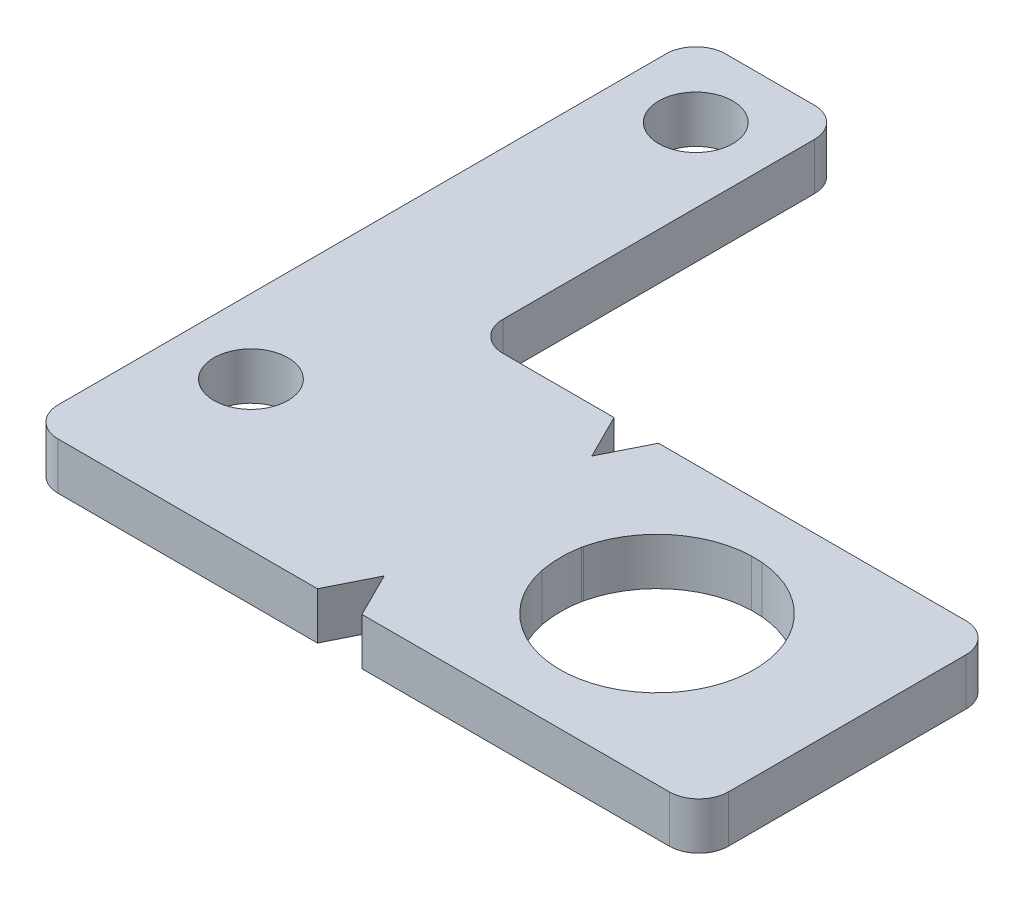
ISO-10303-21;
HEADER;
FILE_DESCRIPTION(('STEP AP214'),'2;1');
FILE_NAME('part.step','',(''),(''),'','','');
FILE_SCHEMA(('AUTOMOTIVE_DESIGN { 1 0 10303 214 1 1 1 1 }'));
ENDSEC;
DATA;
#1=APPLICATION_CONTEXT('core data for automotive mechanical design processes');
#2=APPLICATION_PROTOCOL_DEFINITION('international standard','automotive_design',2000,#1);
#3=PRODUCT_CONTEXT('',#1,'mechanical');
#4=PRODUCT('Part','Part','',(#3));
#5=PRODUCT_RELATED_PRODUCT_CATEGORY('part','',(#4));
#6=PRODUCT_DEFINITION_FORMATION('','',#4);
#7=PRODUCT_DEFINITION_CONTEXT('part definition',#1,'design');
#8=PRODUCT_DEFINITION('design','',#6,#7);
#9=PRODUCT_DEFINITION_SHAPE('','',#8);
#10=(LENGTH_UNIT() NAMED_UNIT(*) SI_UNIT(.MILLI.,.METRE.));
#11=(NAMED_UNIT(*) PLANE_ANGLE_UNIT() SI_UNIT($,.RADIAN.));
#12=(NAMED_UNIT(*) SI_UNIT($,.STERADIAN.) SOLID_ANGLE_UNIT());
#13=UNCERTAINTY_MEASURE_WITH_UNIT(LENGTH_MEASURE(1.E-05),#10,'distance_accuracy_value','');
#14=(GEOMETRIC_REPRESENTATION_CONTEXT(3) GLOBAL_UNCERTAINTY_ASSIGNED_CONTEXT((#13)) GLOBAL_UNIT_ASSIGNED_CONTEXT((#10,
#11,#12)) REPRESENTATION_CONTEXT('',''));
#15=CARTESIAN_POINT('',(0.,0.,0.));
#16=DIRECTION('',(0.,0.,1.));
#17=DIRECTION('',(1.,0.,0.));
#18=AXIS2_PLACEMENT_3D('',#15,#16,#17);
#19=CARTESIAN_POINT('',(45.2120566751476,-1.49186218934005E-13,-20.));
#20=DIRECTION('',(0.,0.,1.));
#21=DIRECTION('',(-1.,0.,0.));
#22=AXIS2_PLACEMENT_3D('',#19,#20,#21);
#23=PLANE('',#22);
#24=DIRECTION('',(-1.,0.,0.));
#25=VECTOR('',#24,1.);
#26=CARTESIAN_POINT('',(45.2120566751476,3.17499999999985,-20.));
#27=LINE('',#26,#25);
#28=CARTESIAN_POINT('',(12.,3.175,-20.));
#29=VERTEX_POINT('',#28);
#30=CARTESIAN_POINT('',(19.4872783375738,3.175,-20.));
#31=VERTEX_POINT('',#30);
#32=EDGE_CURVE('E284',#29,#31,#27,.F.);
#33=ORIENTED_EDGE('',*,*,#32,.T.);
#34=DIRECTION('',(0.,1.,0.));
#35=VECTOR('',#34,1.);
#36=CARTESIAN_POINT('',(19.4872783375738,3.175,-20.));
#37=LINE('',#36,#35);
#38=CARTESIAN_POINT('',(19.4872783375738,0.,-20.));
#39=VERTEX_POINT('',#38);
#40=EDGE_CURVE('E269',#39,#31,#37,.T.);
#41=ORIENTED_EDGE('',*,*,#40,.F.);
#42=DIRECTION('',(1.,0.,0.));
#43=VECTOR('',#42,1.);
#44=CARTESIAN_POINT('',(18.0370566751476,0.,-20.));
#45=LINE('',#44,#43);
#46=CARTESIAN_POINT('',(12.,0.,-20.));
#47=VERTEX_POINT('',#46);
#48=EDGE_CURVE('E401',#47,#39,#45,.T.);
#49=ORIENTED_EDGE('',*,*,#48,.F.);
#50=DIRECTION('',(0.,1.,0.));
#51=VECTOR('',#50,1.);
#52=CARTESIAN_POINT('',(12.,3.175,-20.));
#53=LINE('',#52,#51);
#54=EDGE_CURVE('E291',#47,#29,#53,.T.);
#55=ORIENTED_EDGE('',*,*,#54,.T.);
#56=EDGE_LOOP('',(#33,#41,#49,#55));
#57=FACE_BOUND('',#56,.T.);
#58=ADVANCED_FACE('F106',(#57),#23,.F.);
#59=CARTESIAN_POINT('',(21.2120566751476,0.,0.));
#60=DIRECTION('',(0.,0.,-1.));
#61=DIRECTION('',(0.,1.,0.));
#62=AXIS2_PLACEMENT_3D('',#59,#60,#61);
#63=PLANE('',#62);
#64=DIRECTION('',(1.,0.,0.));
#65=VECTOR('',#64,1.);
#66=CARTESIAN_POINT('',(21.2120566751477,3.17500000000001,0.));
#67=LINE('',#66,#65);
#68=CARTESIAN_POINT('',(43.2120566751477,3.17499999999986,0.));
#69=VERTEX_POINT('',#68);
#70=CARTESIAN_POINT('',(22.4872783375738,3.175,0.));
#71=VERTEX_POINT('',#70);
#72=EDGE_CURVE('E404',#69,#71,#67,.F.);
#73=ORIENTED_EDGE('',*,*,#72,.T.);
#74=DIRECTION('',(0.,1.,0.));
#75=VECTOR('',#74,1.);
#76=CARTESIAN_POINT('',(22.4872783375738,3.175,0.));
#77=LINE('',#76,#75);
#78=CARTESIAN_POINT('',(22.4872783375738,0.,0.));
#79=VERTEX_POINT('',#78);
#80=EDGE_CURVE('E629',#79,#71,#77,.T.);
#81=ORIENTED_EDGE('',*,*,#80,.F.);
#82=DIRECTION('',(-1.,0.,0.));
#83=VECTOR('',#82,1.);
#84=CARTESIAN_POINT('',(18.0370566751476,0.,0.));
#85=LINE('',#84,#83);
#86=CARTESIAN_POINT('',(43.2120566751476,-1.38777878078145E-13,0.));
#87=VERTEX_POINT('',#86);
#88=EDGE_CURVE('E309',#87,#79,#85,.T.);
#89=ORIENTED_EDGE('',*,*,#88,.F.);
#90=DIRECTION('',(0.,1.,0.));
#91=VECTOR('',#90,1.);
#92=CARTESIAN_POINT('',(43.2120566751476,-1.38777878078145E-13,0.));
#93=LINE('',#92,#91);
#94=EDGE_CURVE('E330',#87,#69,#93,.T.);
#95=ORIENTED_EDGE('',*,*,#94,.T.);
#96=EDGE_LOOP('',(#73,#81,#89,#95));
#97=FACE_BOUND('',#96,.T.);
#98=ADVANCED_FACE('F602',(#97),#63,.F.);
#99=CARTESIAN_POINT('',(18.0370566751476,0.,0.));
#100=DIRECTION('',(0.,1.,0.));
#101=DIRECTION('',(-1.,0.,0.));
#102=AXIS2_PLACEMENT_3D('',#99,#100,#101);
#103=PLANE('',#102);
#104=DIRECTION('',(-0.210954578665915,0.,0.97749586481984));
#105=VECTOR('',#104,1.);
#106=CARTESIAN_POINT('',(25.9947010578456,0.,-11.428387084073));
#107=LINE('',#106,#105);
#108=CARTESIAN_POINT('',(25.9947010578456,0.,-11.428387084073));
#109=VERTEX_POINT('',#108);
#110=CARTESIAN_POINT('',(25.9745566751476,0.,-11.3350444749145));
#111=VERTEX_POINT('',#110);
#112=EDGE_CURVE('E714',#109,#111,#107,.T.);
#113=ORIENTED_EDGE('',*,*,#112,.T.);
#114=CARTESIAN_POINT('',(25.9745566751476,0.,-8.66495552508574));
#115=CARTESIAN_POINT('',(25.9336611254421,0.,-8.90403039773948));
#116=CARTESIAN_POINT('',(25.9026822704654,0.,-9.13485281782535));
#117=CARTESIAN_POINT('',(25.8710890300934,0.,-9.46870776910235));
#118=CARTESIAN_POINT('',(25.8630371236516,0.,-9.57792963971937));
#119=CARTESIAN_POINT('',(25.8518916581324,0.,-9.7922471546695));
#120=CARTESIAN_POINT('',(25.8488343775111,0.,-9.89125889598037));
#121=CARTESIAN_POINT('',(25.8455810582544,0.,-10.4368410670471));
#122=CARTESIAN_POINT('',(25.8877053787503,0.,-10.881730781954));
#123=CARTESIAN_POINT('',(25.9745566751476,0.,-11.3350444749145));
#124=B_SPLINE_CURVE_WITH_KNOTS('',3,(#114,#115,#116,#117,#118,#119,#120,#121,#122,#123),
.UNSPECIFIED.,.F.,.F.,(4,2,2,2,4),(0.,0.25,0.375,0.5,1.),.UNSPECIFIED.);
#125=CARTESIAN_POINT('',(25.9745566751476,0.,-8.66495552508574));
#126=VERTEX_POINT('',#125);
#127=EDGE_CURVE('E435',#126,#111,#124,.T.);
#128=ORIENTED_EDGE('',*,*,#127,.F.);
#129=CARTESIAN_POINT('',(25.9745566751477,0.,-8.66495552508554));
#130=CARTESIAN_POINT('',(26.0312900601747,0.,-8.43026918197621));
#131=CARTESIAN_POINT('',(26.1447568302288,0.,-7.96089649575754));
#132=CARTESIAN_POINT('',(26.4121105401859,0.,-7.28608934983438));
#133=CARTESIAN_POINT('',(26.7467661099225,0.,-6.64323408484291));
#134=CARTESIAN_POINT('',(27.1517637105194,0.,-6.04165964216339));
#135=CARTESIAN_POINT('',(27.6202515925038,0.,-5.48831044677415));
#136=CARTESIAN_POINT('',(28.1470236467033,0.,-4.99004629682458));
#137=CARTESIAN_POINT('',(28.7255138680024,0.,-4.552919680838));
#138=CARTESIAN_POINT('',(29.348698845445,0.,-4.18227312022696));
#139=CARTESIAN_POINT('',(30.0089631292878,0.,-3.88262809145767));
#140=CARTESIAN_POINT('',(30.6982512156172,0.,-3.65764213636265));
#141=CARTESIAN_POINT('',(31.40815003869,0.,-3.51006093026402));
#142=CARTESIAN_POINT('',(32.129995886556,0.,-3.44168565515418));
#143=CARTESIAN_POINT('',(32.8549790007588,0.,-3.45335078084182));
#144=CARTESIAN_POINT('',(33.5742513986522,0.,-3.54491394409852));
#145=CARTESIAN_POINT('',(34.2790347763197,0.,-3.71525766914056));
#146=CARTESIAN_POINT('',(34.9607276645069,0.,-3.96230301031872));
#147=CARTESIAN_POINT('',(35.6110103986844,0.,-4.28303492321889));
#148=CARTESIAN_POINT('',(36.2219466572717,0.,-4.67353906184797));
#149=CARTESIAN_POINT('',(36.7860803193948,0.,-5.12904955085714));
#150=CARTESIAN_POINT('',(37.2965264626067,0.,-5.64400715029524));
#151=CARTESIAN_POINT('',(37.7470553893225,0.,-6.21212710288561));
#152=CARTESIAN_POINT('',(38.1321686566539,0.,-6.82647583582406));
#153=CARTESIAN_POINT('',(38.4471661816975,0.,-7.47955558100038));
#154=CARTESIAN_POINT('',(38.6882036033045,0.,-8.16339588085632));
#155=CARTESIAN_POINT('',(38.8523392002772,0.,-8.86965086328776));
#156=CARTESIAN_POINT('',(38.937569793324,0.,-9.58970109772035));
#157=CARTESIAN_POINT('',(38.9428551928322,0.,-10.3147587918309));
#158=CARTESIAN_POINT('',(38.8681308932633,0.,-11.0359750354711));
#159=CARTESIAN_POINT('',(38.71430886232,0.,-11.744547818694));
#160=CARTESIAN_POINT('',(38.4832664037636,0.,-12.4318293721623));
#161=CARTESIAN_POINT('',(38.1778232726974,0.,-13.0894320178612));
#162=CARTESIAN_POINT('',(37.8017071625224,0.,-13.7093293798909));
#163=CARTESIAN_POINT('',(37.3595085822399,0.,-14.2839586556845));
#164=CARTESIAN_POINT('',(36.8566234450337,0.,-14.8062968156151));
#165=CARTESIAN_POINT('',(36.299192390395,0.,-15.2700064009538));
#166=CARTESIAN_POINT('',(35.6940065237312,0.,-15.6692886249439));
#167=CARTESIAN_POINT('',(35.0484966286503,0.,-15.9997910332968));
#168=CARTESIAN_POINT('',(34.3703734209777,0.,-16.2555373085362));
#169=CARTESIAN_POINT('',(33.6685375806048,0.,-16.4406565770764));
#170=CARTESIAN_POINT('',(33.1889949501497,0.,-16.4974394270471));
#171=CARTESIAN_POINT('',(32.9492236349221,0.,-16.5258308520324));
#172=B_SPLINE_CURVE_WITH_KNOTS('',3,(#129,#130,#131,#132,#133,#134,#135,#136,#137,#138,#139,
#140,#141,#142,#143,#144,#145,#146,#147,#148,#149,#150,#151,#152,#153,#154,#155,#156,#157,#158,
#159,#160,#161,#162,#163,#164,#165,#166,#167,#168,#169,#170,#171),.UNSPECIFIED.,.F.,.F.,(4,1,1,
1,1,1,1,1,1,1,1,1,1,1,1,1,1,1,1,1,1,1,1,1,1,1,1,1,1,1,1,1,1,1,1,1,1,1,1,1,4),(0.,0.025,0.05,
0.075,0.1,0.125,0.15,0.175,0.2,0.225,0.25,0.275,0.3,0.325,0.35,0.375,0.4,0.425,0.45,0.475,0.5,
0.525,0.55,0.575,0.6,0.625,0.65,0.675,0.7,0.725,0.75,0.775,0.8,0.825,0.85,0.875,0.9,0.925,0.95,
0.975,1.),.UNSPECIFIED.);
#173=CARTESIAN_POINT('',(32.9492236349221,0.,-16.5258308520324));
#174=VERTEX_POINT('',#173);
#175=EDGE_CURVE('E380',#126,#174,#172,.T.);
#176=ORIENTED_EDGE('',*,*,#175,.T.);
#177=DIRECTION('',(-0.999529779588222,0.,-0.0306630024022591));
#178=VECTOR('',#177,1.);
#179=CARTESIAN_POINT('',(32.9492236349221,0.,-16.5258308520324));
#180=LINE('',#179,#178);
#181=CARTESIAN_POINT('',(32.2259617867948,0.,-16.5480186649816));
#182=VERTEX_POINT('',#181);
#183=EDGE_CURVE('E302',#174,#182,#180,.T.);
#184=ORIENTED_EDGE('',*,*,#183,.T.);
#185=CARTESIAN_POINT('',(32.2259617867948,0.,-16.5480186649816));
#186=CARTESIAN_POINT('',(31.9849010309936,0.,-16.5343779314185));
#187=CARTESIAN_POINT('',(31.5027795193912,0.,-16.5070964642925));
#188=CARTESIAN_POINT('',(30.7909161828021,0.,-16.3653458438791));
#189=CARTESIAN_POINT('',(30.0983915048754,0.,-16.1516475424966));
#190=CARTESIAN_POINT('',(29.4338370293086,0.,-15.8613344543529));
#191=CARTESIAN_POINT('',(28.8053126701854,0.,-15.499899602249));
#192=CARTESIAN_POINT('',(28.2205118605238,0.,-15.0712295735479));
#193=CARTESIAN_POINT('',(27.6865317005137,0.,-14.5807041723674));
#194=CARTESIAN_POINT('',(27.2100266580371,0.,-14.0342419441934));
#195=CARTESIAN_POINT('',(26.796302046705,0.,-13.4386361298149));
#196=CARTESIAN_POINT('',(26.4523101933546,0.,-12.8007278304648));
#197=CARTESIAN_POINT('',(26.17514723399,0.,-12.1298900390997));
#198=CARTESIAN_POINT('',(26.0548497832271,0.,-11.6622214024152));
#199=CARTESIAN_POINT('',(25.9947010578456,0.,-11.428387084073));
#200=B_SPLINE_CURVE_WITH_KNOTS('',3,(#185,#186,#187,#188,#189,#190,#191,#192,#193,#194,#195,
#196,#197,#198,#199),.UNSPECIFIED.,.F.,.F.,(4,1,1,1,1,1,1,1,1,1,1,1,4),(0.,0.083333333333333,
0.166666666666666,0.25,0.333333333333333,0.416666666666667,0.5,0.583333333333333,
0.666666666666666,0.75,0.833333333333333,0.916666666666667,1.),.UNSPECIFIED.);
#201=EDGE_CURVE('E368',#182,#109,#200,.T.);
#202=ORIENTED_EDGE('',*,*,#201,.T.);
#203=EDGE_LOOP('',(#113,#128,#176,#184,#202));
#204=FACE_BOUND('',#203,.T.);
#205=ORIENTED_EDGE('',*,*,#48,.T.);
#206=DIRECTION('',(0.447213595499957,0.,0.894427190999916));
#207=VECTOR('',#206,1.);
#208=CARTESIAN_POINT('',(19.4872783375738,0.,-20.));
#209=LINE('',#208,#207);
#210=CARTESIAN_POINT('',(20.9872783375738,0.,-17.));
#211=VERTEX_POINT('',#210);
#212=EDGE_CURVE('E274',#39,#211,#209,.T.);
#213=ORIENTED_EDGE('',*,*,#212,.T.);
#214=DIRECTION('',(0.447213595499957,0.,-0.894427190999916));
#215=VECTOR('',#214,1.);
#216=CARTESIAN_POINT('',(20.9872783375738,0.,-17.));
#217=LINE('',#216,#215);
#218=CARTESIAN_POINT('',(22.4872783375738,0.,-20.));
#219=VERTEX_POINT('',#218);
#220=EDGE_CURVE('E627',#211,#219,#217,.T.);
#221=ORIENTED_EDGE('',*,*,#220,.T.);
#222=CARTESIAN_POINT('',(43.2120566751476,-1.35308431126191E-13,-20.));
#223=VERTEX_POINT('',#222);
#224=EDGE_CURVE('E403',#219,#223,#45,.T.);
#225=ORIENTED_EDGE('',*,*,#224,.T.);
#226=CARTESIAN_POINT('',(43.2120566751476,-1.35308431126191E-13,-18.));
#227=DIRECTION('',(0.,1.,0.));
#228=DIRECTION('',(-1.,0.,0.));
#229=AXIS2_PLACEMENT_3D('',#226,#227,#228);
#230=CIRCLE('',#229,2.);
#231=CARTESIAN_POINT('',(45.2120566751476,-1.49186218934005E-13,-18.));
#232=VERTEX_POINT('',#231);
#233=EDGE_CURVE('E327',#223,#232,#230,.F.);
#234=ORIENTED_EDGE('',*,*,#233,.T.);
#235=DIRECTION('',(0.,0.,1.));
#236=VECTOR('',#235,1.);
#237=CARTESIAN_POINT('',(45.2120566751476,-1.52655665885959E-13,0.));
#238=LINE('',#237,#236);
#239=CARTESIAN_POINT('',(45.2120566751476,-1.52655665885959E-13,-2.00000000000001));
#240=VERTEX_POINT('',#239);
#241=EDGE_CURVE('E397',#232,#240,#238,.T.);
#242=ORIENTED_EDGE('',*,*,#241,.T.);
#243=CARTESIAN_POINT('',(43.2120566751476,-1.38777878078145E-13,-2.00000000000001));
#244=DIRECTION('',(0.,1.,0.));
#245=DIRECTION('',(-1.,0.,0.));
#246=AXIS2_PLACEMENT_3D('',#243,#244,#245);
#247=CIRCLE('',#246,2.);
#248=EDGE_CURVE('E324',#240,#87,#247,.F.);
#249=ORIENTED_EDGE('',*,*,#248,.T.);
#250=ORIENTED_EDGE('',*,*,#88,.T.);
#251=DIRECTION('',(-0.447213595499961,0.,-0.894427190999915));
#252=VECTOR('',#251,1.);
#253=CARTESIAN_POINT('',(22.4872783375738,0.,0.));
#254=LINE('',#253,#252);
#255=CARTESIAN_POINT('',(20.9872783375738,0.,-3.));
#256=VERTEX_POINT('',#255);
#257=EDGE_CURVE('E647',#79,#256,#254,.T.);
#258=ORIENTED_EDGE('',*,*,#257,.T.);
#259=DIRECTION('',(-0.447213595499961,0.,0.894427190999915));
#260=VECTOR('',#259,1.);
#261=CARTESIAN_POINT('',(20.9872783375738,0.,-3.));
#262=LINE('',#261,#260);
#263=CARTESIAN_POINT('',(19.4872783375738,0.,0.));
#264=VERTEX_POINT('',#263);
#265=EDGE_CURVE('E648',#256,#264,#262,.T.);
#266=ORIENTED_EDGE('',*,*,#265,.T.);
#267=CARTESIAN_POINT('',(2.,0.,0.));
#268=VERTEX_POINT('',#267);
#269=EDGE_CURVE('E396',#264,#268,#85,.T.);
#270=ORIENTED_EDGE('',*,*,#269,.T.);
#271=CARTESIAN_POINT('',(2.,0.,-2.));
#272=DIRECTION('',(0.,-1.,0.));
#273=DIRECTION('',(0.,0.,-1.));
#274=AXIS2_PLACEMENT_3D('',#271,#272,#273);
#275=CIRCLE('',#274,2.);
#276=CARTESIAN_POINT('',(0.,0.,-2.));
#277=VERTEX_POINT('',#276);
#278=EDGE_CURVE('E433',#268,#277,#275,.T.);
#279=ORIENTED_EDGE('',*,*,#278,.T.);
#280=DIRECTION('',(0.,0.,-1.));
#281=VECTOR('',#280,1.);
#282=CARTESIAN_POINT('',(0.,0.,0.));
#283=LINE('',#282,#281);
#284=CARTESIAN_POINT('',(0.,0.,-43.));
#285=VERTEX_POINT('',#284);
#286=EDGE_CURVE('E504',#285,#277,#283,.F.);
#287=ORIENTED_EDGE('',*,*,#286,.F.);
#288=CARTESIAN_POINT('',(2.,0.,-43.));
#289=DIRECTION('',(0.,-1.,0.));
#290=DIRECTION('',(0.,0.,-1.));
#291=AXIS2_PLACEMENT_3D('',#288,#289,#290);
#292=CIRCLE('',#291,2.);
#293=CARTESIAN_POINT('',(2.,0.,-45.));
#294=VERTEX_POINT('',#293);
#295=EDGE_CURVE('E451',#285,#294,#292,.T.);
#296=ORIENTED_EDGE('',*,*,#295,.T.);
#297=DIRECTION('',(1.,0.,0.));
#298=VECTOR('',#297,1.);
#299=CARTESIAN_POINT('',(0.,0.,-45.));
#300=LINE('',#299,#298);
#301=CARTESIAN_POINT('',(8.,0.,-45.));
#302=VERTEX_POINT('',#301);
#303=EDGE_CURVE('E497',#302,#294,#300,.F.);
#304=ORIENTED_EDGE('',*,*,#303,.F.);
#305=CARTESIAN_POINT('',(8.,0.,-43.));
#306=DIRECTION('',(0.,-1.,0.));
#307=DIRECTION('',(0.,0.,-1.));
#308=AXIS2_PLACEMENT_3D('',#305,#306,#307);
#309=CIRCLE('',#308,2.);
#310=CARTESIAN_POINT('',(10.,0.,-43.));
#311=VERTEX_POINT('',#310);
#312=EDGE_CURVE('E448',#302,#311,#309,.T.);
#313=ORIENTED_EDGE('',*,*,#312,.T.);
#314=DIRECTION('',(0.,0.,-1.));
#315=VECTOR('',#314,1.);
#316=CARTESIAN_POINT('',(10.,0.,0.));
#317=LINE('',#316,#315);
#318=CARTESIAN_POINT('',(10.,0.,-22.));
#319=VERTEX_POINT('',#318);
#320=EDGE_CURVE('E279',#319,#311,#317,.T.);
#321=ORIENTED_EDGE('',*,*,#320,.F.);
#322=CARTESIAN_POINT('',(12.,0.,-22.));
#323=DIRECTION('',(0.,-1.,0.));
#324=DIRECTION('',(0.,0.,-1.));
#325=AXIS2_PLACEMENT_3D('',#322,#323,#324);
#326=CIRCLE('',#325,2.);
#327=EDGE_CURVE('E440',#319,#47,#326,.F.);
#328=ORIENTED_EDGE('',*,*,#327,.T.);
#329=EDGE_LOOP('',(#205,#213,#221,#225,#234,#242,#249,#250,#258,#266,#270,#279,#287,#296,#304,
#313,#321,#328));
#330=FACE_BOUND('',#329,.T.);
#331=CARTESIAN_POINT('',(5.,0.,-10.));
#332=DIRECTION('',(0.,1.,0.));
#333=DIRECTION('',(0.,0.,1.));
#334=AXIS2_PLACEMENT_3D('',#331,#332,#333);
#335=CIRCLE('',#334,2.5);
#336=CARTESIAN_POINT('',(5.,0.,-7.5));
#337=VERTEX_POINT('',#336);
#338=EDGE_CURVE('E458',#337,#337,#335,.T.);
#339=ORIENTED_EDGE('',*,*,#338,.T.);
#340=EDGE_LOOP('',(#339));
#341=FACE_BOUND('',#340,.T.);
#342=CARTESIAN_POINT('',(5.,0.,-40.));
#343=DIRECTION('',(0.,1.,0.));
#344=DIRECTION('',(0.,0.,1.));
#345=AXIS2_PLACEMENT_3D('',#342,#343,#344);
#346=CIRCLE('',#345,2.5);
#347=CARTESIAN_POINT('',(5.,0.,-37.5));
#348=VERTEX_POINT('',#347);
#349=EDGE_CURVE('E454',#348,#348,#346,.T.);
#350=ORIENTED_EDGE('',*,*,#349,.T.);
#351=EDGE_LOOP('',(#350));
#352=FACE_BOUND('',#351,.T.);
#353=ADVANCED_FACE('F608',(#204,#330,#341,#352),#103,.F.);
#354=CARTESIAN_POINT('',(0.,3.175,0.));
#355=DIRECTION('',(0.,-1.,0.));
#356=DIRECTION('',(0.,0.,-1.));
#357=AXIS2_PLACEMENT_3D('',#354,#355,#356);
#358=PLANE('',#357);
#359=DIRECTION('',(0.447213595499957,0.,-0.894427190999916));
#360=VECTOR('',#359,1.);
#361=CARTESIAN_POINT('',(20.9872783375738,3.175,-17.));
#362=LINE('',#361,#360);
#363=CARTESIAN_POINT('',(20.9872783375738,3.175,-17.));
#364=VERTEX_POINT('',#363);
#365=CARTESIAN_POINT('',(22.4872783375738,3.17500000000001,-20.));
#366=VERTEX_POINT('',#365);
#367=EDGE_CURVE('E130',#364,#366,#362,.T.);
#368=ORIENTED_EDGE('',*,*,#367,.F.);
#369=DIRECTION('',(0.447213595499957,0.,0.894427190999916));
#370=VECTOR('',#369,1.);
#371=CARTESIAN_POINT('',(19.4872783375738,3.175,-20.));
#372=LINE('',#371,#370);
#373=EDGE_CURVE('E272',#31,#364,#372,.T.);
#374=ORIENTED_EDGE('',*,*,#373,.F.);
#375=ORIENTED_EDGE('',*,*,#32,.F.);
#376=CARTESIAN_POINT('',(12.,3.175,-22.));
#377=DIRECTION('',(0.,-1.,0.));
#378=DIRECTION('',(0.,0.,-1.));
#379=AXIS2_PLACEMENT_3D('',#376,#377,#378);
#380=CIRCLE('',#379,2.);
#381=CARTESIAN_POINT('',(10.,3.175,-22.));
#382=VERTEX_POINT('',#381);
#383=EDGE_CURVE('E430',#29,#382,#380,.T.);
#384=ORIENTED_EDGE('',*,*,#383,.T.);
#385=DIRECTION('',(0.,0.,-1.));
#386=VECTOR('',#385,1.);
#387=CARTESIAN_POINT('',(10.,3.175,0.));
#388=LINE('',#387,#386);
#389=CARTESIAN_POINT('',(10.,3.175,-43.));
#390=VERTEX_POINT('',#389);
#391=EDGE_CURVE('E467',#382,#390,#388,.T.);
#392=ORIENTED_EDGE('',*,*,#391,.T.);
#393=CARTESIAN_POINT('',(8.,3.175,-43.));
#394=DIRECTION('',(0.,-1.,0.));
#395=DIRECTION('',(0.,0.,-1.));
#396=AXIS2_PLACEMENT_3D('',#393,#394,#395);
#397=CIRCLE('',#396,2.);
#398=CARTESIAN_POINT('',(8.,3.175,-45.));
#399=VERTEX_POINT('',#398);
#400=EDGE_CURVE('E464',#390,#399,#397,.F.);
#401=ORIENTED_EDGE('',*,*,#400,.T.);
#402=DIRECTION('',(-1.,0.,0.));
#403=VECTOR('',#402,1.);
#404=CARTESIAN_POINT('',(0.,3.175,-45.));
#405=LINE('',#404,#403);
#406=CARTESIAN_POINT('',(2.,3.175,-45.));
#407=VERTEX_POINT('',#406);
#408=EDGE_CURVE('E478',#399,#407,#405,.T.);
#409=ORIENTED_EDGE('',*,*,#408,.T.);
#410=CARTESIAN_POINT('',(2.,3.175,-43.));
#411=DIRECTION('',(0.,-1.,0.));
#412=DIRECTION('',(0.,0.,-1.));
#413=AXIS2_PLACEMENT_3D('',#410,#411,#412);
#414=CIRCLE('',#413,2.);
#415=CARTESIAN_POINT('',(0.,3.175,-43.));
#416=VERTEX_POINT('',#415);
#417=EDGE_CURVE('E475',#407,#416,#414,.F.);
#418=ORIENTED_EDGE('',*,*,#417,.T.);
#419=DIRECTION('',(0.,0.,1.));
#420=VECTOR('',#419,1.);
#421=CARTESIAN_POINT('',(0.,3.175,0.));
#422=LINE('',#421,#420);
#423=CARTESIAN_POINT('',(0.,3.175,-2.));
#424=VERTEX_POINT('',#423);
#425=EDGE_CURVE('E425',#416,#424,#422,.T.);
#426=ORIENTED_EDGE('',*,*,#425,.T.);
#427=CARTESIAN_POINT('',(2.,3.175,-2.));
#428=DIRECTION('',(0.,-1.,0.));
#429=DIRECTION('',(0.,0.,-1.));
#430=AXIS2_PLACEMENT_3D('',#427,#428,#429);
#431=CIRCLE('',#430,2.);
#432=CARTESIAN_POINT('',(2.,3.175,0.));
#433=VERTEX_POINT('',#432);
#434=EDGE_CURVE('E423',#424,#433,#431,.F.);
#435=ORIENTED_EDGE('',*,*,#434,.T.);
#436=CARTESIAN_POINT('',(19.4872783375738,3.17500000000002,0.));
#437=VERTEX_POINT('',#436);
#438=EDGE_CURVE('E300',#437,#433,#67,.F.);
#439=ORIENTED_EDGE('',*,*,#438,.F.);
#440=DIRECTION('',(-0.447213595499961,0.,0.894427190999915));
#441=VECTOR('',#440,1.);
#442=CARTESIAN_POINT('',(20.9872783375738,3.175,-3.));
#443=LINE('',#442,#441);
#444=CARTESIAN_POINT('',(20.9872783375738,3.175,-3.));
#445=VERTEX_POINT('',#444);
#446=EDGE_CURVE('E138',#445,#437,#443,.T.);
#447=ORIENTED_EDGE('',*,*,#446,.F.);
#448=DIRECTION('',(-0.447213595499961,0.,-0.894427190999915));
#449=VECTOR('',#448,1.);
#450=CARTESIAN_POINT('',(22.4872783375738,3.175,0.));
#451=LINE('',#450,#449);
#452=EDGE_CURVE('E641',#71,#445,#451,.T.);
#453=ORIENTED_EDGE('',*,*,#452,.F.);
#454=ORIENTED_EDGE('',*,*,#72,.F.);
#455=CARTESIAN_POINT('',(43.2120566751477,3.17499999999986,-2.00000000000001));
#456=DIRECTION('',(0.,1.,0.));
#457=DIRECTION('',(-1.,0.,0.));
#458=AXIS2_PLACEMENT_3D('',#455,#456,#457);
#459=CIRCLE('',#458,2.);
#460=CARTESIAN_POINT('',(45.2120566751477,3.17499999999984,-2.00000000000001));
#461=VERTEX_POINT('',#460);
#462=EDGE_CURVE('E313',#69,#461,#459,.T.);
#463=ORIENTED_EDGE('',*,*,#462,.T.);
#464=DIRECTION('',(0.,0.,-1.));
#465=VECTOR('',#464,1.);
#466=CARTESIAN_POINT('',(45.2120566751477,3.17499999999984,0.));
#467=LINE('',#466,#465);
#468=CARTESIAN_POINT('',(45.2120566751476,3.17499999999985,-18.));
#469=VERTEX_POINT('',#468);
#470=EDGE_CURVE('E294',#469,#461,#467,.F.);
#471=ORIENTED_EDGE('',*,*,#470,.F.);
#472=CARTESIAN_POINT('',(43.2120566751476,3.17499999999986,-18.));
#473=DIRECTION('',(0.,1.,0.));
#474=DIRECTION('',(-1.,0.,0.));
#475=AXIS2_PLACEMENT_3D('',#472,#473,#474);
#476=CIRCLE('',#475,2.);
#477=CARTESIAN_POINT('',(43.2120566751476,3.17499999999986,-20.));
#478=VERTEX_POINT('',#477);
#479=EDGE_CURVE('E316',#469,#478,#476,.T.);
#480=ORIENTED_EDGE('',*,*,#479,.T.);
#481=EDGE_CURVE('E295',#366,#478,#27,.F.);
#482=ORIENTED_EDGE('',*,*,#481,.F.);
#483=EDGE_LOOP('',(#368,#374,#375,#384,#392,#401,#409,#418,#426,#435,#439,#447,#453,#454,#463,
#471,#480,#482));
#484=FACE_BOUND('',#483,.T.);
#485=DIRECTION('',(-0.999529779588222,0.,-0.0306630024022591));
#486=VECTOR('',#485,1.);
#487=CARTESIAN_POINT('',(32.9492236349221,3.175,-16.5258308520324));
#488=LINE('',#487,#486);
#489=CARTESIAN_POINT('',(32.9492236349221,3.175,-16.5258308520324));
#490=VERTEX_POINT('',#489);
#491=CARTESIAN_POINT('',(32.2259617867948,3.17500000000004,-16.5480186649816));
#492=VERTEX_POINT('',#491);
#493=EDGE_CURVE('E385',#490,#492,#488,.T.);
#494=ORIENTED_EDGE('',*,*,#493,.F.);
#495=CARTESIAN_POINT('',(25.9745566751477,3.17499999999999,-8.66495552508554));
#496=CARTESIAN_POINT('',(26.0312900601747,3.17499999999999,-8.43026918197621));
#497=CARTESIAN_POINT('',(26.1447568302288,3.17499999999999,-7.96089649575754));
#498=CARTESIAN_POINT('',(26.4121105401859,3.17499999999999,-7.28608934983437));
#499=CARTESIAN_POINT('',(26.7467661099225,3.17499999999999,-6.64323408484291));
#500=CARTESIAN_POINT('',(27.1517637105194,3.17499999999999,-6.04165964216339));
#501=CARTESIAN_POINT('',(27.6202515925038,3.17499999999999,-5.48831044677414));
#502=CARTESIAN_POINT('',(28.1470236467033,3.17499999999999,-4.99004629682458));
#503=CARTESIAN_POINT('',(28.7255138680024,3.17499999999999,-4.552919680838));
#504=CARTESIAN_POINT('',(29.348698845445,3.17499999999999,-4.18227312022696));
#505=CARTESIAN_POINT('',(30.0089631292878,3.17499999999999,-3.88262809145767));
#506=CARTESIAN_POINT('',(30.6982512156172,3.17499999999999,-3.65764213636265));
#507=CARTESIAN_POINT('',(31.40815003869,3.17499999999999,-3.51006093026402));
#508=CARTESIAN_POINT('',(32.129995886556,3.17499999999999,-3.44168565515417));
#509=CARTESIAN_POINT('',(32.8549790007588,3.17499999999999,-3.45335078084182));
#510=CARTESIAN_POINT('',(33.5742513986522,3.17499999999999,-3.54491394409852));
#511=CARTESIAN_POINT('',(34.2790347763197,3.17499999999999,-3.71525766914056));
#512=CARTESIAN_POINT('',(34.9607276645069,3.17499999999999,-3.96230301031872));
#513=CARTESIAN_POINT('',(35.6110103986844,3.17499999999999,-4.28303492321889));
#514=CARTESIAN_POINT('',(36.2219466572717,3.17499999999999,-4.67353906184797));
#515=CARTESIAN_POINT('',(36.7860803193947,3.17499999999999,-5.12904955085714));
#516=CARTESIAN_POINT('',(37.2965264626067,3.17499999999999,-5.64400715029524));
#517=CARTESIAN_POINT('',(37.7470553893225,3.17499999999999,-6.21212710288561));
#518=CARTESIAN_POINT('',(38.1321686566539,3.17499999999999,-6.82647583582406));
#519=CARTESIAN_POINT('',(38.4471661816975,3.17499999999999,-7.47955558100038));
#520=CARTESIAN_POINT('',(38.6882036033045,3.17499999999999,-8.16339588085632));
#521=CARTESIAN_POINT('',(38.8523392002772,3.17499999999999,-8.86965086328776));
#522=CARTESIAN_POINT('',(38.937569793324,3.175,-9.58970109772034));
#523=CARTESIAN_POINT('',(38.9428551928322,3.175,-10.3147587918309));
#524=CARTESIAN_POINT('',(38.8681308932633,3.175,-11.0359750354711));
#525=CARTESIAN_POINT('',(38.71430886232,3.175,-11.744547818694));
#526=CARTESIAN_POINT('',(38.4832664037636,3.17499999999999,-12.4318293721623));
#527=CARTESIAN_POINT('',(38.1778232726974,3.175,-13.0894320178612));
#528=CARTESIAN_POINT('',(37.8017071625224,3.17499999999999,-13.7093293798909));
#529=CARTESIAN_POINT('',(37.3595085822399,3.175,-14.2839586556845));
#530=CARTESIAN_POINT('',(36.8566234450337,3.175,-14.8062968156151));
#531=CARTESIAN_POINT('',(36.299192390395,3.175,-15.2700064009538));
#532=CARTESIAN_POINT('',(35.6940065237312,3.17499999999999,-15.6692886249439));
#533=CARTESIAN_POINT('',(35.0484966286503,3.175,-15.9997910332968));
#534=CARTESIAN_POINT('',(34.3703734209777,3.175,-16.2555373085362));
#535=CARTESIAN_POINT('',(33.6685375806048,3.17499999999999,-16.4406565770764));
#536=CARTESIAN_POINT('',(33.1889949501497,3.175,-16.4974394270471));
#537=CARTESIAN_POINT('',(32.9492236349221,3.175,-16.5258308520324));
#538=B_SPLINE_CURVE_WITH_KNOTS('',3,(#495,#496,#497,#498,#499,#500,#501,#502,#503,#504,#505,
#506,#507,#508,#509,#510,#511,#512,#513,#514,#515,#516,#517,#518,#519,#520,#521,#522,#523,#524,
#525,#526,#527,#528,#529,#530,#531,#532,#533,#534,#535,#536,#537),.UNSPECIFIED.,.F.,.F.,(4,1,1,
1,1,1,1,1,1,1,1,1,1,1,1,1,1,1,1,1,1,1,1,1,1,1,1,1,1,1,1,1,1,1,1,1,1,1,1,1,4),(0.,0.025,0.05,
0.075,0.1,0.125,0.15,0.175,0.2,0.225,0.25,0.275,0.3,0.325,0.35,0.375,0.4,0.425,0.45,0.475,0.5,
0.525,0.55,0.575,0.6,0.625,0.65,0.675,0.7,0.725,0.75,0.775,0.8,0.825,0.85,0.875,0.9,0.925,0.95,
0.975,1.),.UNSPECIFIED.);
#539=CARTESIAN_POINT('',(25.9745566751476,3.175,-8.66495552508574));
#540=VERTEX_POINT('',#539);
#541=EDGE_CURVE('E716',#540,#490,#538,.T.);
#542=ORIENTED_EDGE('',*,*,#541,.F.);
#543=CARTESIAN_POINT('',(25.9745566751476,3.175,-8.66495552508574));
#544=CARTESIAN_POINT('',(25.9541164224589,3.175,-8.78454928824268));
#545=CARTESIAN_POINT('',(25.9357060381694,3.175,-8.90452593384844));
#546=CARTESIAN_POINT('',(25.9035944933191,3.175,-9.14518796001527));
#547=CARTESIAN_POINT('',(25.8898965942702,3.175,-9.26587377287056));
#548=CARTESIAN_POINT('',(25.8733882907796,3.175,-9.44730044610424));
#549=CARTESIAN_POINT('',(25.8685578392427,3.175,-9.50785908318072));
#550=CARTESIAN_POINT('',(25.8603476735424,3.175,-9.62907595813485));
#551=CARTESIAN_POINT('',(25.8569679504221,3.175,-9.68973419539524));
#552=CARTESIAN_POINT('',(25.8530267705972,3.175,-9.780758618482));
#553=CARTESIAN_POINT('',(25.851901204965,3.175,-9.81110121716634));
#554=CARTESIAN_POINT('',(25.8500879920213,3.175,-9.87179964609166));
#555=CARTESIAN_POINT('',(25.8494003405291,3.175,-9.90215547620356));
#556=CARTESIAN_POINT('',(25.8479519561343,3.175,-9.99323140951691));
#557=CARTESIAN_POINT('',(25.8478057849476,3.175,-10.053960150649));
#558=CARTESIAN_POINT('',(25.8509347776379,3.175,-10.319100693698));
#559=CARTESIAN_POINT('',(25.8631233378088,3.175,-10.5235007951788));
#560=CARTESIAN_POINT('',(25.8949801310638,3.175,-10.8288400147788));
#561=CARTESIAN_POINT('',(25.907891871283,3.175,-10.9305657025297));
#562=CARTESIAN_POINT('',(25.9380372888088,3.175,-11.1333346943962));
#563=CARTESIAN_POINT('',(25.9552692441192,3.175,-11.2343782539616));
#564=CARTESIAN_POINT('',(25.9745566751476,3.175,-11.3350444749145));
#565=B_SPLINE_CURVE_WITH_KNOTS('',3,(#543,#544,#545,#546,#547,#548,#549,#550,#551,#552,#553,
#554,#555,#556,#557,#558,#559,#560,#561,#562,#563,#564),.UNSPECIFIED.,.F.,.F.,(4,2,2,2,2,2,2,2,
2,2,4),(0.,0.364023677317224,0.728298791027,0.910536878143319,1.09277384007333,1.18386200321869,
1.27494929676947,1.45712329871843,2.07033240163691,2.3778882755013,2.68532175490941),.UNSPECIFIED.);
#566=CARTESIAN_POINT('',(25.9745566751476,3.175,-11.3350444749145));
#567=VERTEX_POINT('',#566);
#568=EDGE_CURVE('E439',#540,#567,#565,.T.);
#569=ORIENTED_EDGE('',*,*,#568,.T.);
#570=DIRECTION('',(-0.210954578665915,0.,0.97749586481984));
#571=VECTOR('',#570,1.);
#572=CARTESIAN_POINT('',(25.9947010578456,3.175,-11.428387084073));
#573=LINE('',#572,#571);
#574=CARTESIAN_POINT('',(25.9947010578456,3.17500000000004,-11.428387084073));
#575=VERTEX_POINT('',#574);
#576=EDGE_CURVE('E343',#575,#567,#573,.T.);
#577=ORIENTED_EDGE('',*,*,#576,.F.);
#578=CARTESIAN_POINT('',(32.2259617867948,3.175,-16.5480186649816));
#579=CARTESIAN_POINT('',(31.9849010309936,3.175,-16.5343779314185));
#580=CARTESIAN_POINT('',(31.5027795193912,3.17499999999999,-16.5070964642925));
#581=CARTESIAN_POINT('',(30.7909161828021,3.175,-16.3653458438791));
#582=CARTESIAN_POINT('',(30.0983915048754,3.175,-16.1516475424966));
#583=CARTESIAN_POINT('',(29.4338370293086,3.175,-15.8613344543529));
#584=CARTESIAN_POINT('',(28.8053126701854,3.175,-15.499899602249));
#585=CARTESIAN_POINT('',(28.2205118605238,3.175,-15.0712295735479));
#586=CARTESIAN_POINT('',(27.6865317005137,3.17499999999999,-14.5807041723674));
#587=CARTESIAN_POINT('',(27.2100266580371,3.175,-14.0342419441934));
#588=CARTESIAN_POINT('',(26.796302046705,3.175,-13.4386361298149));
#589=CARTESIAN_POINT('',(26.4523101933546,3.175,-12.8007278304648));
#590=CARTESIAN_POINT('',(26.17514723399,3.175,-12.1298900390997));
#591=CARTESIAN_POINT('',(26.0548497832271,3.175,-11.6622214024152));
#592=CARTESIAN_POINT('',(25.9947010578456,3.175,-11.428387084073));
#593=B_SPLINE_CURVE_WITH_KNOTS('',3,(#578,#579,#580,#581,#582,#583,#584,#585,#586,#587,#588,
#589,#590,#591,#592),.UNSPECIFIED.,.F.,.F.,(4,1,1,1,1,1,1,1,1,1,1,1,4),(0.,0.083333333333333,
0.166666666666666,0.25,0.333333333333333,0.416666666666667,0.5,0.583333333333333,
0.666666666666666,0.75,0.833333333333333,0.916666666666667,1.),.UNSPECIFIED.);
#594=EDGE_CURVE('E698',#492,#575,#593,.T.);
#595=ORIENTED_EDGE('',*,*,#594,.F.);
#596=EDGE_LOOP('',(#494,#542,#569,#577,#595));
#597=FACE_BOUND('',#596,.T.);
#598=CARTESIAN_POINT('',(5.,3.175,-10.));
#599=DIRECTION('',(0.,1.,0.));
#600=DIRECTION('',(0.,0.,1.));
#601=AXIS2_PLACEMENT_3D('',#598,#599,#600);
#602=CIRCLE('',#601,2.5);
#603=CARTESIAN_POINT('',(5.,3.175,-7.5));
#604=VERTEX_POINT('',#603);
#605=EDGE_CURVE('E482',#604,#604,#602,.T.);
#606=ORIENTED_EDGE('',*,*,#605,.F.);
#607=EDGE_LOOP('',(#606));
#608=FACE_BOUND('',#607,.T.);
#609=CARTESIAN_POINT('',(5.,3.175,-40.));
#610=DIRECTION('',(0.,1.,0.));
#611=DIRECTION('',(0.,0.,1.));
#612=AXIS2_PLACEMENT_3D('',#609,#610,#611);
#613=CIRCLE('',#612,2.5);
#614=CARTESIAN_POINT('',(5.,3.175,-37.5));
#615=VERTEX_POINT('',#614);
#616=EDGE_CURVE('E486',#615,#615,#613,.T.);
#617=ORIENTED_EDGE('',*,*,#616,.F.);
#618=EDGE_LOOP('',(#617));
#619=FACE_BOUND('',#618,.T.);
#620=ADVANCED_FACE('F108',(#484,#597,#608,#619),#358,.F.);
#621=ORIENTED_EDGE('',*,*,#224,.F.);
#622=DIRECTION('',(0.,1.,0.));
#623=VECTOR('',#622,1.);
#624=CARTESIAN_POINT('',(22.4872783375738,3.175,-20.));
#625=LINE('',#624,#623);
#626=EDGE_CURVE('E288',#219,#366,#625,.T.);
#627=ORIENTED_EDGE('',*,*,#626,.T.);
#628=ORIENTED_EDGE('',*,*,#481,.T.);
#629=DIRECTION('',(0.,1.,0.));
#630=VECTOR('',#629,1.);
#631=CARTESIAN_POINT('',(43.2120566751476,-1.35308431126191E-13,-20.));
#632=LINE('',#631,#630);
#633=EDGE_CURVE('E320',#478,#223,#632,.F.);
#634=ORIENTED_EDGE('',*,*,#633,.T.);
#635=EDGE_LOOP('',(#621,#627,#628,#634));
#636=FACE_BOUND('',#635,.T.);
#637=ADVANCED_FACE('F604',(#636),#23,.F.);
#638=ORIENTED_EDGE('',*,*,#269,.F.);
#639=DIRECTION('',(0.,1.,0.));
#640=VECTOR('',#639,1.);
#641=CARTESIAN_POINT('',(19.4872783375738,3.175,0.));
#642=LINE('',#641,#640);
#643=EDGE_CURVE('E421',#264,#437,#642,.T.);
#644=ORIENTED_EDGE('',*,*,#643,.T.);
#645=ORIENTED_EDGE('',*,*,#438,.T.);
#646=DIRECTION('',(0.,-1.,0.));
#647=VECTOR('',#646,1.);
#648=CARTESIAN_POINT('',(2.,3.175,0.));
#649=LINE('',#648,#647);
#650=EDGE_CURVE('E419',#433,#268,#649,.T.);
#651=ORIENTED_EDGE('',*,*,#650,.T.);
#652=EDGE_LOOP('',(#638,#644,#645,#651));
#653=FACE_BOUND('',#652,.T.);
#654=ADVANCED_FACE('F417',(#653),#63,.F.);
#655=CARTESIAN_POINT('',(45.2120566751476,-1.52655665885959E-13,0.));
#656=DIRECTION('',(-1.,0.,0.));
#657=DIRECTION('',(0.,-1.,0.));
#658=AXIS2_PLACEMENT_3D('',#655,#656,#657);
#659=PLANE('',#658);
#660=ORIENTED_EDGE('',*,*,#241,.F.);
#661=DIRECTION('',(0.,1.,0.));
#662=VECTOR('',#661,1.);
#663=CARTESIAN_POINT('',(45.2120566751476,-1.49186218934005E-13,-18.));
#664=LINE('',#663,#662);
#665=EDGE_CURVE('E308',#232,#469,#664,.T.);
#666=ORIENTED_EDGE('',*,*,#665,.T.);
#667=ORIENTED_EDGE('',*,*,#470,.T.);
#668=DIRECTION('',(0.,1.,0.));
#669=VECTOR('',#668,1.);
#670=CARTESIAN_POINT('',(45.2120566751476,-1.52655665885959E-13,-2.00000000000001));
#671=LINE('',#670,#669);
#672=EDGE_CURVE('E305',#461,#240,#671,.F.);
#673=ORIENTED_EDGE('',*,*,#672,.T.);
#674=EDGE_LOOP('',(#660,#666,#667,#673));
#675=FACE_BOUND('',#674,.T.);
#676=ADVANCED_FACE('F618',(#675),#659,.F.);
#677=CARTESIAN_POINT('',(43.2120566751476,-1.35308431126191E-13,-18.));
#678=DIRECTION('',(0.,1.,0.));
#679=DIRECTION('',(-1.,0.,0.));
#680=AXIS2_PLACEMENT_3D('',#677,#678,#679);
#681=CYLINDRICAL_SURFACE('',#680,2.);
#682=ORIENTED_EDGE('',*,*,#233,.F.);
#683=ORIENTED_EDGE('',*,*,#633,.F.);
#684=ORIENTED_EDGE('',*,*,#479,.F.);
#685=ORIENTED_EDGE('',*,*,#665,.F.);
#686=EDGE_LOOP('',(#682,#683,#684,#685));
#687=FACE_BOUND('',#686,.T.);
#688=ADVANCED_FACE('F669',(#687),#681,.T.);
#689=CARTESIAN_POINT('',(43.2120566751476,-1.38777878078145E-13,-2.00000000000001));
#690=DIRECTION('',(0.,1.,0.));
#691=DIRECTION('',(-1.,0.,0.));
#692=AXIS2_PLACEMENT_3D('',#689,#690,#691);
#693=CYLINDRICAL_SURFACE('',#692,2.);
#694=ORIENTED_EDGE('',*,*,#248,.F.);
#695=ORIENTED_EDGE('',*,*,#672,.F.);
#696=ORIENTED_EDGE('',*,*,#462,.F.);
#697=ORIENTED_EDGE('',*,*,#94,.F.);
#698=EDGE_LOOP('',(#694,#695,#696,#697));
#699=FACE_BOUND('',#698,.T.);
#700=ADVANCED_FACE('F666',(#699),#693,.T.);
#701=CARTESIAN_POINT('',(32.9492236349221,0.,-16.5258308520324));
#702=DIRECTION('',(0.0306630024022591,0.,-0.999529779588222));
#703=DIRECTION('',(-0.999529779588222,0.,-0.0306630024022591));
#704=AXIS2_PLACEMENT_3D('',#701,#702,#703);
#705=PLANE('',#704);
#706=ORIENTED_EDGE('',*,*,#493,.T.);
#707=DIRECTION('',(0.,1.,0.));
#708=VECTOR('',#707,1.);
#709=CARTESIAN_POINT('',(32.2259617867948,0.,-16.5480186649816));
#710=LINE('',#709,#708);
#711=EDGE_CURVE('E373',#492,#182,#710,.F.);
#712=ORIENTED_EDGE('',*,*,#711,.T.);
#713=ORIENTED_EDGE('',*,*,#183,.F.);
#714=DIRECTION('',(0.,1.,0.));
#715=VECTOR('',#714,1.);
#716=CARTESIAN_POINT('',(32.9492236349221,0.,-16.5258308520324));
#717=LINE('',#716,#715);
#718=EDGE_CURVE('E386',#490,#174,#717,.F.);
#719=ORIENTED_EDGE('',*,*,#718,.F.);
#720=EDGE_LOOP('',(#706,#712,#713,#719));
#721=FACE_BOUND('',#720,.T.);
#722=ADVANCED_FACE('F361',(#721),#705,.F.);
#723=DIRECTION('',(0.,1.,0.));
#724=VECTOR('',#723,1.);
#725=SURFACE_OF_LINEAR_EXTRUSION('',#172,#724);
#726=DIRECTION('',(0.,1.,0.));
#727=VECTOR('',#726,1.);
#728=CARTESIAN_POINT('',(25.9745566751477,0.,-8.66495552508554));
#729=LINE('',#728,#727);
#730=EDGE_CURVE('E14',#540,#126,#729,.F.);
#731=ORIENTED_EDGE('',*,*,#730,.F.);
#732=ORIENTED_EDGE('',*,*,#541,.T.);
#733=ORIENTED_EDGE('',*,*,#718,.T.);
#734=ORIENTED_EDGE('',*,*,#175,.F.);
#735=EDGE_LOOP('',(#731,#732,#733,#734));
#736=FACE_BOUND('',#735,.T.);
#737=ADVANCED_FACE('F356',(#736),#725,.F.);
#738=CARTESIAN_POINT('',(25.9947010578456,0.,-11.428387084073));
#739=DIRECTION('',(-0.97749586481984,0.,-0.210954578665915));
#740=DIRECTION('',(-0.210954578665915,0.,0.97749586481984));
#741=AXIS2_PLACEMENT_3D('',#738,#739,#740);
#742=PLANE('',#741);
#743=DIRECTION('',(0.,1.,0.));
#744=VECTOR('',#743,1.);
#745=CARTESIAN_POINT('',(25.9947010578456,0.,-11.428387084073));
#746=LINE('',#745,#744);
#747=EDGE_CURVE('E703',#575,#109,#746,.F.);
#748=ORIENTED_EDGE('',*,*,#747,.F.);
#749=ORIENTED_EDGE('',*,*,#576,.T.);
#750=CARTESIAN_POINT('',(25.9745566751476,0.,-11.3350444749145));
#751=CARTESIAN_POINT('',(25.9745566751476,3.175,-11.3350444749145));
#752=B_SPLINE_CURVE_WITH_KNOTS('',1,(#750,#751),.UNSPECIFIED.,.F.,.F.,(2,2),(0.,1.),.UNSPECIFIED.);
#753=EDGE_CURVE('E122',#567,#111,#752,.F.);
#754=ORIENTED_EDGE('',*,*,#753,.T.);
#755=ORIENTED_EDGE('',*,*,#112,.F.);
#756=EDGE_LOOP('',(#748,#749,#754,#755));
#757=FACE_BOUND('',#756,.T.);
#758=ADVANCED_FACE('F345',(#757),#742,.F.);
#759=DIRECTION('',(0.,1.,0.));
#760=VECTOR('',#759,1.);
#761=SURFACE_OF_LINEAR_EXTRUSION('',#200,#760);
#762=ORIENTED_EDGE('',*,*,#711,.F.);
#763=ORIENTED_EDGE('',*,*,#594,.T.);
#764=ORIENTED_EDGE('',*,*,#747,.T.);
#765=ORIENTED_EDGE('',*,*,#201,.F.);
#766=EDGE_LOOP('',(#762,#763,#764,#765));
#767=FACE_BOUND('',#766,.T.);
#768=ADVANCED_FACE('F355',(#767),#761,.F.);
#769=CARTESIAN_POINT('',(25.9745566751476,3.175,-8.66495552508574));
#770=CARTESIAN_POINT('',(25.9336611254421,3.175,-8.90403039773948));
#771=CARTESIAN_POINT('',(25.9026822704654,3.175,-9.13485281782535));
#772=CARTESIAN_POINT('',(25.8710890300934,3.175,-9.46870776910235));
#773=CARTESIAN_POINT('',(25.8630371236516,3.175,-9.57792963971937));
#774=CARTESIAN_POINT('',(25.8518916581324,3.175,-9.7922471546695));
#775=CARTESIAN_POINT('',(25.8488343775111,3.175,-9.89125889598037));
#776=CARTESIAN_POINT('',(25.8455810582544,3.175,-10.4368410670471));
#777=CARTESIAN_POINT('',(25.8877053787503,3.175,-10.881730781954));
#778=CARTESIAN_POINT('',(25.9745566751476,3.175,-11.3350444749145));
#779=CARTESIAN_POINT('',(25.9745566751476,0.,-8.66495552508574));
#780=CARTESIAN_POINT('',(25.9336611254421,0.,-8.90403039773948));
#781=CARTESIAN_POINT('',(25.9026822704654,0.,-9.13485281782535));
#782=CARTESIAN_POINT('',(25.8710890300934,0.,-9.46870776910235));
#783=CARTESIAN_POINT('',(25.8630371236516,0.,-9.57792963971937));
#784=CARTESIAN_POINT('',(25.8518916581324,0.,-9.7922471546695));
#785=CARTESIAN_POINT('',(25.8488343775111,0.,-9.89125889598037));
#786=CARTESIAN_POINT('',(25.8455810582544,0.,-10.4368410670471));
#787=CARTESIAN_POINT('',(25.8877053787503,0.,-10.881730781954));
#788=CARTESIAN_POINT('',(25.9745566751476,0.,-11.3350444749145));
#789=B_SPLINE_SURFACE_WITH_KNOTS('',1,3,((#769,#770,#771,#772,#773,#774,#775,#776,#777,#778),
(#779,#780,#781,#782,#783,#784,#785,#786,#787,#788)),.UNSPECIFIED.,.F.,.F.,.F.,(2,2),(4,2,2,2,
4),(0.,1.),(0.,0.25,0.375,0.5,1.),.UNSPECIFIED.);
#790=ORIENTED_EDGE('',*,*,#730,.T.);
#791=ORIENTED_EDGE('',*,*,#127,.T.);
#792=ORIENTED_EDGE('',*,*,#753,.F.);
#793=ORIENTED_EDGE('',*,*,#568,.F.);
#794=EDGE_LOOP('',(#790,#791,#792,#793));
#795=FACE_BOUND('',#794,.T.);
#796=ADVANCED_FACE('F529',(#795),#789,.T.);
#797=CARTESIAN_POINT('',(8.,3.175,-43.));
#798=DIRECTION('',(0.,1.,0.));
#799=DIRECTION('',(0.,0.,1.));
#800=AXIS2_PLACEMENT_3D('',#797,#798,#799);
#801=CYLINDRICAL_SURFACE('',#800,2.);
#802=ORIENTED_EDGE('',*,*,#312,.F.);
#803=DIRECTION('',(0.,-1.,0.));
#804=VECTOR('',#803,1.);
#805=CARTESIAN_POINT('',(8.,3.175,-45.));
#806=LINE('',#805,#804);
#807=EDGE_CURVE('E490',#399,#302,#806,.T.);
#808=ORIENTED_EDGE('',*,*,#807,.F.);
#809=ORIENTED_EDGE('',*,*,#400,.F.);
#810=DIRECTION('',(0.,-1.,0.));
#811=VECTOR('',#810,1.);
#812=CARTESIAN_POINT('',(10.,3.175,-43.));
#813=LINE('',#812,#811);
#814=EDGE_CURVE('E515',#311,#390,#813,.F.);
#815=ORIENTED_EDGE('',*,*,#814,.F.);
#816=EDGE_LOOP('',(#802,#808,#809,#815));
#817=FACE_BOUND('',#816,.T.);
#818=ADVANCED_FACE('F540',(#817),#801,.T.);
#819=CARTESIAN_POINT('',(10.,3.175,0.));
#820=DIRECTION('',(-1.,0.,0.));
#821=DIRECTION('',(0.,0.,-1.));
#822=AXIS2_PLACEMENT_3D('',#819,#820,#821);
#823=PLANE('',#822);
#824=ORIENTED_EDGE('',*,*,#320,.T.);
#825=ORIENTED_EDGE('',*,*,#814,.T.);
#826=ORIENTED_EDGE('',*,*,#391,.F.);
#827=DIRECTION('',(0.,-1.,0.));
#828=VECTOR('',#827,1.);
#829=CARTESIAN_POINT('',(10.,0.,-22.));
#830=LINE('',#829,#828);
#831=EDGE_CURVE('E511',#382,#319,#830,.T.);
#832=ORIENTED_EDGE('',*,*,#831,.T.);
#833=EDGE_LOOP('',(#824,#825,#826,#832));
#834=FACE_BOUND('',#833,.T.);
#835=ADVANCED_FACE('F581',(#834),#823,.F.);
#836=CARTESIAN_POINT('',(12.,3.175,-22.));
#837=DIRECTION('',(0.,-1.,0.));
#838=DIRECTION('',(0.,0.,-1.));
#839=AXIS2_PLACEMENT_3D('',#836,#837,#838);
#840=CYLINDRICAL_SURFACE('',#839,2.);
#841=ORIENTED_EDGE('',*,*,#383,.F.);
#842=ORIENTED_EDGE('',*,*,#54,.F.);
#843=ORIENTED_EDGE('',*,*,#327,.F.);
#844=ORIENTED_EDGE('',*,*,#831,.F.);
#845=EDGE_LOOP('',(#841,#842,#843,#844));
#846=FACE_BOUND('',#845,.T.);
#847=ADVANCED_FACE('F578',(#846),#840,.F.);
#848=CARTESIAN_POINT('',(2.,3.175,-2.));
#849=DIRECTION('',(0.,1.,0.));
#850=DIRECTION('',(0.,0.,1.));
#851=AXIS2_PLACEMENT_3D('',#848,#849,#850);
#852=CYLINDRICAL_SURFACE('',#851,2.);
#853=ORIENTED_EDGE('',*,*,#278,.F.);
#854=ORIENTED_EDGE('',*,*,#650,.F.);
#855=ORIENTED_EDGE('',*,*,#434,.F.);
#856=DIRECTION('',(0.,-1.,0.));
#857=VECTOR('',#856,1.);
#858=CARTESIAN_POINT('',(0.,3.175,-2.));
#859=LINE('',#858,#857);
#860=EDGE_CURVE('E501',#277,#424,#859,.F.);
#861=ORIENTED_EDGE('',*,*,#860,.F.);
#862=EDGE_LOOP('',(#853,#854,#855,#861));
#863=FACE_BOUND('',#862,.T.);
#864=ADVANCED_FACE('F432',(#863),#852,.T.);
#865=CARTESIAN_POINT('',(0.,3.175,0.));
#866=DIRECTION('',(1.,0.,0.));
#867=DIRECTION('',(0.,0.,1.));
#868=AXIS2_PLACEMENT_3D('',#865,#866,#867);
#869=PLANE('',#868);
#870=ORIENTED_EDGE('',*,*,#425,.F.);
#871=DIRECTION('',(0.,-1.,0.));
#872=VECTOR('',#871,1.);
#873=CARTESIAN_POINT('',(0.,3.175,-43.));
#874=LINE('',#873,#872);
#875=EDGE_CURVE('E508',#416,#285,#874,.T.);
#876=ORIENTED_EDGE('',*,*,#875,.T.);
#877=ORIENTED_EDGE('',*,*,#286,.T.);
#878=ORIENTED_EDGE('',*,*,#860,.T.);
#879=EDGE_LOOP('',(#870,#876,#877,#878));
#880=FACE_BOUND('',#879,.T.);
#881=ADVANCED_FACE('F571',(#880),#869,.F.);
#882=CARTESIAN_POINT('',(2.,3.175,-43.));
#883=DIRECTION('',(0.,1.,0.));
#884=DIRECTION('',(0.,0.,1.));
#885=AXIS2_PLACEMENT_3D('',#882,#883,#884);
#886=CYLINDRICAL_SURFACE('',#885,2.);
#887=ORIENTED_EDGE('',*,*,#295,.F.);
#888=ORIENTED_EDGE('',*,*,#875,.F.);
#889=ORIENTED_EDGE('',*,*,#417,.F.);
#890=DIRECTION('',(0.,-1.,0.));
#891=VECTOR('',#890,1.);
#892=CARTESIAN_POINT('',(2.,3.175,-45.));
#893=LINE('',#892,#891);
#894=EDGE_CURVE('E493',#294,#407,#893,.F.);
#895=ORIENTED_EDGE('',*,*,#894,.F.);
#896=EDGE_LOOP('',(#887,#888,#889,#895));
#897=FACE_BOUND('',#896,.T.);
#898=ADVANCED_FACE('F567',(#897),#886,.T.);
#899=CARTESIAN_POINT('',(0.,3.175,-45.));
#900=DIRECTION('',(0.,0.,1.));
#901=DIRECTION('',(-1.,0.,0.));
#902=AXIS2_PLACEMENT_3D('',#899,#900,#901);
#903=PLANE('',#902);
#904=ORIENTED_EDGE('',*,*,#303,.T.);
#905=ORIENTED_EDGE('',*,*,#894,.T.);
#906=ORIENTED_EDGE('',*,*,#408,.F.);
#907=ORIENTED_EDGE('',*,*,#807,.T.);
#908=EDGE_LOOP('',(#904,#905,#906,#907));
#909=FACE_BOUND('',#908,.T.);
#910=ADVANCED_FACE('F563',(#909),#903,.F.);
#911=CARTESIAN_POINT('',(5.,3.175,-40.));
#912=DIRECTION('',(0.,-1.,0.));
#913=DIRECTION('',(0.,0.,-1.));
#914=AXIS2_PLACEMENT_3D('',#911,#912,#913);
#915=CYLINDRICAL_SURFACE('',#914,2.5);
#916=ORIENTED_EDGE('',*,*,#616,.T.);
#917=EDGE_LOOP('',(#916));
#918=FACE_BOUND('',#917,.T.);
#919=ORIENTED_EDGE('',*,*,#349,.F.);
#920=EDGE_LOOP('',(#919));
#921=FACE_BOUND('',#920,.T.);
#922=ADVANCED_FACE('F559',(#918,#921),#915,.F.);
#923=CARTESIAN_POINT('',(5.,3.175,-10.));
#924=DIRECTION('',(0.,-1.,0.));
#925=DIRECTION('',(0.,0.,-1.));
#926=AXIS2_PLACEMENT_3D('',#923,#924,#925);
#927=CYLINDRICAL_SURFACE('',#926,2.5);
#928=ORIENTED_EDGE('',*,*,#605,.T.);
#929=EDGE_LOOP('',(#928));
#930=FACE_BOUND('',#929,.T.);
#931=ORIENTED_EDGE('',*,*,#338,.F.);
#932=EDGE_LOOP('',(#931));
#933=FACE_BOUND('',#932,.T.);
#934=ADVANCED_FACE('F541',(#930,#933),#927,.F.);
#935=CARTESIAN_POINT('',(22.4872783375738,3.175,0.));
#936=DIRECTION('',(0.894427190999915,0.,-0.447213595499961));
#937=DIRECTION('',(-0.447213595499961,0.,-0.894427190999915));
#938=AXIS2_PLACEMENT_3D('',#935,#936,#937);
#939=PLANE('',#938);
#940=ORIENTED_EDGE('',*,*,#80,.T.);
#941=ORIENTED_EDGE('',*,*,#452,.T.);
#942=DIRECTION('',(0.,1.,0.));
#943=VECTOR('',#942,1.);
#944=CARTESIAN_POINT('',(20.9872783375738,3.175,-3.));
#945=LINE('',#944,#943);
#946=EDGE_CURVE('E634',#256,#445,#945,.T.);
#947=ORIENTED_EDGE('',*,*,#946,.F.);
#948=ORIENTED_EDGE('',*,*,#257,.F.);
#949=EDGE_LOOP('',(#940,#941,#947,#948));
#950=FACE_BOUND('',#949,.T.);
#951=ADVANCED_FACE('F558',(#950),#939,.F.);
#952=CARTESIAN_POINT('',(20.9872783375738,3.175,-3.));
#953=DIRECTION('',(-0.894427190999915,0.,-0.447213595499961));
#954=DIRECTION('',(-0.447213595499961,0.,0.894427190999915));
#955=AXIS2_PLACEMENT_3D('',#952,#953,#954);
#956=PLANE('',#955);
#957=ORIENTED_EDGE('',*,*,#946,.T.);
#958=ORIENTED_EDGE('',*,*,#446,.T.);
#959=ORIENTED_EDGE('',*,*,#643,.F.);
#960=ORIENTED_EDGE('',*,*,#265,.F.);
#961=EDGE_LOOP('',(#957,#958,#959,#960));
#962=FACE_BOUND('',#961,.T.);
#963=ADVANCED_FACE('F591',(#962),#956,.F.);
#964=CARTESIAN_POINT('',(19.4872783375738,3.175,-20.));
#965=DIRECTION('',(-0.894427190999917,0.,0.447213595499957));
#966=DIRECTION('',(0.447213595499957,0.,0.894427190999916));
#967=AXIS2_PLACEMENT_3D('',#964,#965,#966);
#968=PLANE('',#967);
#969=ORIENTED_EDGE('',*,*,#40,.T.);
#970=ORIENTED_EDGE('',*,*,#373,.T.);
#971=DIRECTION('',(0.,1.,0.));
#972=VECTOR('',#971,1.);
#973=CARTESIAN_POINT('',(20.9872783375738,3.175,-17.));
#974=LINE('',#973,#972);
#975=EDGE_CURVE('E280',#211,#364,#974,.T.);
#976=ORIENTED_EDGE('',*,*,#975,.F.);
#977=ORIENTED_EDGE('',*,*,#212,.F.);
#978=EDGE_LOOP('',(#969,#970,#976,#977));
#979=FACE_BOUND('',#978,.T.);
#980=ADVANCED_FACE('F271',(#979),#968,.F.);
#981=CARTESIAN_POINT('',(20.9872783375738,3.175,-17.));
#982=DIRECTION('',(0.894427190999917,0.,0.447213595499957));
#983=DIRECTION('',(0.447213595499957,0.,-0.894427190999916));
#984=AXIS2_PLACEMENT_3D('',#981,#982,#983);
#985=PLANE('',#984);
#986=ORIENTED_EDGE('',*,*,#975,.T.);
#987=ORIENTED_EDGE('',*,*,#367,.T.);
#988=ORIENTED_EDGE('',*,*,#626,.F.);
#989=ORIENTED_EDGE('',*,*,#220,.F.);
#990=EDGE_LOOP('',(#986,#987,#988,#989));
#991=FACE_BOUND('',#990,.T.);
#992=ADVANCED_FACE('F597',(#991),#985,.F.);
#993=CLOSED_SHELL('',(#58,#98,#353,#620,#637,#654,#676,#688,#700,#722,#737,#758,#768,#796,#818,
#835,#847,#864,#881,#898,#910,#922,#934,#951,#963,#980,#992));
#994=MANIFOLD_SOLID_BREP('B2',#993);
#995=ADVANCED_BREP_SHAPE_REPRESENTATION('',(#18,#994),#14);
#996=SHAPE_DEFINITION_REPRESENTATION(#9,#995);
ENDSEC;
END-ISO-10303-21;
